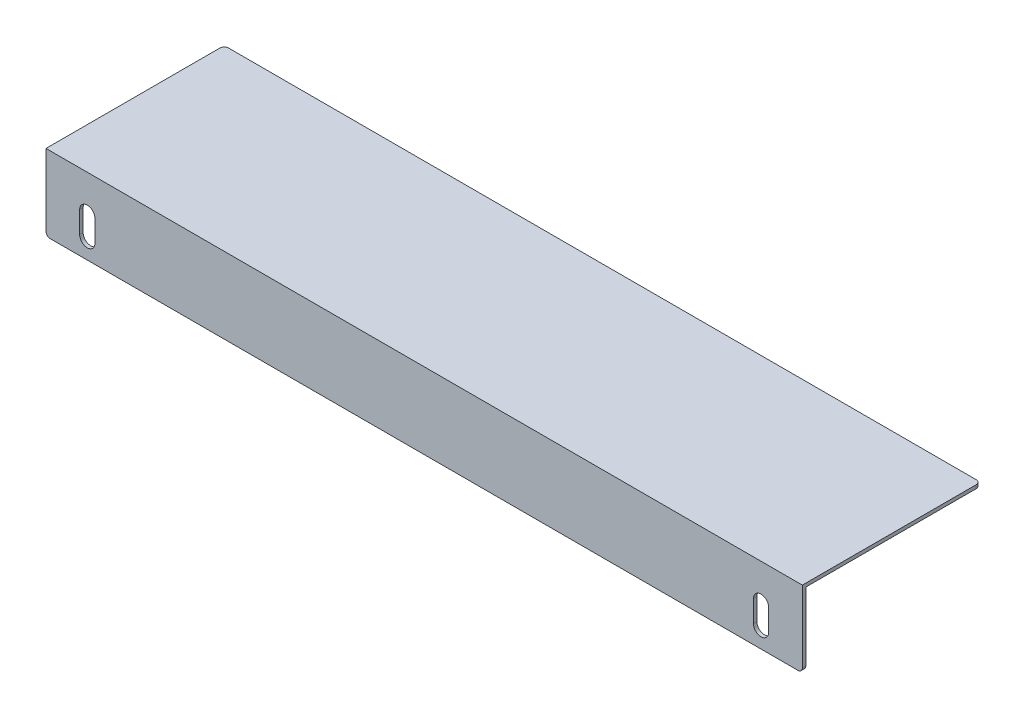
ISO-10303-21;
HEADER;
FILE_DESCRIPTION(('STEP AP214'),'2;1');
FILE_NAME('part.step','',(''),(''),'','','');
FILE_SCHEMA(('AUTOMOTIVE_DESIGN { 1 0 10303 214 1 1 1 1 }'));
ENDSEC;
DATA;
#1=APPLICATION_CONTEXT('core data for automotive mechanical design processes');
#2=APPLICATION_PROTOCOL_DEFINITION('international standard','automotive_design',2000,#1);
#3=PRODUCT_CONTEXT('',#1,'mechanical');
#4=PRODUCT('Part','Part','',(#3));
#5=PRODUCT_RELATED_PRODUCT_CATEGORY('part','',(#4));
#6=PRODUCT_DEFINITION_FORMATION('','',#4);
#7=PRODUCT_DEFINITION_CONTEXT('part definition',#1,'design');
#8=PRODUCT_DEFINITION('design','',#6,#7);
#9=PRODUCT_DEFINITION_SHAPE('','',#8);
#10=(LENGTH_UNIT() NAMED_UNIT(*) SI_UNIT(.MILLI.,.METRE.));
#11=(NAMED_UNIT(*) PLANE_ANGLE_UNIT() SI_UNIT($,.RADIAN.));
#12=(NAMED_UNIT(*) SI_UNIT($,.STERADIAN.) SOLID_ANGLE_UNIT());
#13=UNCERTAINTY_MEASURE_WITH_UNIT(LENGTH_MEASURE(1.E-05),#10,'distance_accuracy_value','');
#14=(GEOMETRIC_REPRESENTATION_CONTEXT(3) GLOBAL_UNCERTAINTY_ASSIGNED_CONTEXT((#13)) GLOBAL_UNIT_ASSIGNED_CONTEXT((#10,
#11,#12)) REPRESENTATION_CONTEXT('',''));
#15=CARTESIAN_POINT('',(0.,0.,0.));
#16=DIRECTION('',(0.,0.,1.));
#17=DIRECTION('',(1.,0.,0.));
#18=AXIS2_PLACEMENT_3D('',#15,#16,#17);
#19=CARTESIAN_POINT('',(279.,0.,0.));
#20=DIRECTION('',(0.,0.,-1.));
#21=DIRECTION('',(-1.,0.,0.));
#22=AXIS2_PLACEMENT_3D('',#19,#20,#21);
#23=PLANE('',#22);
#24=DIRECTION('',(-1.,0.,0.));
#25=VECTOR('',#24,1.);
#26=CARTESIAN_POINT('',(279.,-35.,0.));
#27=LINE('',#26,#25);
#28=CARTESIAN_POINT('',(67.,-35.,0.));
#29=VERTEX_POINT('',#28);
#30=CARTESIAN_POINT('',(-277.,-35.,0.));
#31=VERTEX_POINT('',#30);
#32=EDGE_CURVE('E41',#29,#31,#27,.T.);
#33=ORIENTED_EDGE('',*,*,#32,.F.);
#34=CARTESIAN_POINT('',(67.,-33.,0.));
#35=DIRECTION('',(0.,0.,1.));
#36=DIRECTION('',(0.,1.,0.));
#37=AXIS2_PLACEMENT_3D('',#34,#35,#36);
#38=CIRCLE('',#37,2.);
#39=CARTESIAN_POINT('',(69.,-33.,0.));
#40=VERTEX_POINT('',#39);
#41=EDGE_CURVE('E11',#29,#40,#38,.T.);
#42=ORIENTED_EDGE('',*,*,#41,.T.);
#43=DIRECTION('',(0.,1.,0.));
#44=VECTOR('',#43,1.);
#45=CARTESIAN_POINT('',(69.,-35.,0.));
#46=LINE('',#45,#44);
#47=CARTESIAN_POINT('',(69.,0.,0.));
#48=VERTEX_POINT('',#47);
#49=EDGE_CURVE('E27',#40,#48,#46,.T.);
#50=ORIENTED_EDGE('',*,*,#49,.T.);
#51=DIRECTION('',(-1.,0.,0.));
#52=VECTOR('',#51,1.);
#53=CARTESIAN_POINT('',(279.,0.,0.));
#54=LINE('',#53,#52);
#55=CARTESIAN_POINT('',(-279.,0.,0.));
#56=VERTEX_POINT('',#55);
#57=EDGE_CURVE('E261',#48,#56,#54,.T.);
#58=ORIENTED_EDGE('',*,*,#57,.T.);
#59=DIRECTION('',(0.,-1.,0.));
#60=VECTOR('',#59,1.);
#61=CARTESIAN_POINT('',(-279.,0.,0.));
#62=LINE('',#61,#60);
#63=CARTESIAN_POINT('',(-279.,-33.,0.));
#64=VERTEX_POINT('',#63);
#65=EDGE_CURVE('E267',#56,#64,#62,.T.);
#66=ORIENTED_EDGE('',*,*,#65,.T.);
#67=CARTESIAN_POINT('',(-277.,-33.,0.));
#68=DIRECTION('',(0.,0.,1.));
#69=DIRECTION('',(0.,1.,0.));
#70=AXIS2_PLACEMENT_3D('',#67,#68,#69);
#71=CIRCLE('',#70,2.);
#72=EDGE_CURVE('E216',#64,#31,#71,.T.);
#73=ORIENTED_EDGE('',*,*,#72,.T.);
#74=EDGE_LOOP('',(#33,#42,#50,#58,#66,#73));
#75=FACE_BOUND('',#74,.T.);
#76=DIRECTION('',(0.,-1.,0.));
#77=VECTOR('',#76,1.);
#78=CARTESIAN_POINT('',(-263.5,-16.6,0.));
#79=LINE('',#78,#77);
#80=CARTESIAN_POINT('',(-263.5,-16.6,0.));
#81=VERTEX_POINT('',#80);
#82=CARTESIAN_POINT('',(-263.5,-26.6,0.));
#83=VERTEX_POINT('',#82);
#84=EDGE_CURVE('E230',#81,#83,#79,.T.);
#85=ORIENTED_EDGE('',*,*,#84,.F.);
#86=CARTESIAN_POINT('',(-260.,-16.6,0.));
#87=DIRECTION('',(0.,0.,1.));
#88=DIRECTION('',(1.,0.,0.));
#89=AXIS2_PLACEMENT_3D('',#86,#87,#88);
#90=CIRCLE('',#89,3.5);
#91=CARTESIAN_POINT('',(-256.5,-16.6,0.));
#92=VERTEX_POINT('',#91);
#93=EDGE_CURVE('E274',#92,#81,#90,.T.);
#94=ORIENTED_EDGE('',*,*,#93,.F.);
#95=DIRECTION('',(0.,1.,0.));
#96=VECTOR('',#95,1.);
#97=CARTESIAN_POINT('',(-256.5,-16.6,0.));
#98=LINE('',#97,#96);
#99=CARTESIAN_POINT('',(-256.5,-26.6,0.));
#100=VERTEX_POINT('',#99);
#101=EDGE_CURVE('E203',#100,#92,#98,.T.);
#102=ORIENTED_EDGE('',*,*,#101,.F.);
#103=CARTESIAN_POINT('',(-260.,-26.6,0.));
#104=DIRECTION('',(0.,0.,1.));
#105=DIRECTION('',(1.,0.,0.));
#106=AXIS2_PLACEMENT_3D('',#103,#104,#105);
#107=CIRCLE('',#106,3.5);
#108=EDGE_CURVE('E265',#83,#100,#107,.T.);
#109=ORIENTED_EDGE('',*,*,#108,.F.);
#110=EDGE_LOOP('',(#85,#94,#102,#109));
#111=FACE_BOUND('',#110,.T.);
#112=DIRECTION('',(0.,-1.,0.));
#113=VECTOR('',#112,1.);
#114=CARTESIAN_POINT('',(46.5,-16.6,0.));
#115=LINE('',#114,#113);
#116=CARTESIAN_POINT('',(46.5,-16.6,0.));
#117=VERTEX_POINT('',#116);
#118=CARTESIAN_POINT('',(46.5,-26.6,0.));
#119=VERTEX_POINT('',#118);
#120=EDGE_CURVE('E192',#117,#119,#115,.T.);
#121=ORIENTED_EDGE('',*,*,#120,.F.);
#122=CARTESIAN_POINT('',(50.,-16.6,0.));
#123=DIRECTION('',(0.,0.,1.));
#124=DIRECTION('',(1.,0.,0.));
#125=AXIS2_PLACEMENT_3D('',#122,#123,#124);
#126=CIRCLE('',#125,3.5);
#127=CARTESIAN_POINT('',(53.5,-16.6,0.));
#128=VERTEX_POINT('',#127);
#129=EDGE_CURVE('E242',#128,#117,#126,.T.);
#130=ORIENTED_EDGE('',*,*,#129,.F.);
#131=DIRECTION('',(0.,1.,0.));
#132=VECTOR('',#131,1.);
#133=CARTESIAN_POINT('',(53.5,-16.6,0.));
#134=LINE('',#133,#132);
#135=CARTESIAN_POINT('',(53.5,-26.6,0.));
#136=VERTEX_POINT('',#135);
#137=EDGE_CURVE('E205',#136,#128,#134,.T.);
#138=ORIENTED_EDGE('',*,*,#137,.F.);
#139=CARTESIAN_POINT('',(50.,-26.6,0.));
#140=DIRECTION('',(0.,0.,1.));
#141=DIRECTION('',(1.,0.,0.));
#142=AXIS2_PLACEMENT_3D('',#139,#140,#141);
#143=CIRCLE('',#142,3.5);
#144=EDGE_CURVE('E283',#119,#136,#143,.T.);
#145=ORIENTED_EDGE('',*,*,#144,.F.);
#146=EDGE_LOOP('',(#121,#130,#138,#145));
#147=FACE_BOUND('',#146,.T.);
#148=ADVANCED_FACE('F16',(#75,#111,#147),#23,.F.);
#149=CARTESIAN_POINT('',(279.,-35.,-1.6));
#150=DIRECTION('',(0.,-1.,0.));
#151=DIRECTION('',(0.,0.,-1.));
#152=AXIS2_PLACEMENT_3D('',#149,#150,#151);
#153=PLANE('',#152);
#154=DIRECTION('',(-1.,0.,0.));
#155=VECTOR('',#154,1.);
#156=CARTESIAN_POINT('',(279.,-35.,-1.6));
#157=LINE('',#156,#155);
#158=CARTESIAN_POINT('',(67.,-35.,-1.6));
#159=VERTEX_POINT('',#158);
#160=CARTESIAN_POINT('',(-277.,-35.,-1.6));
#161=VERTEX_POINT('',#160);
#162=EDGE_CURVE('E186',#159,#161,#157,.T.);
#163=ORIENTED_EDGE('',*,*,#162,.F.);
#164=DIRECTION('',(0.,0.,1.));
#165=VECTOR('',#164,1.);
#166=CARTESIAN_POINT('',(67.,-35.,0.));
#167=LINE('',#166,#165);
#168=EDGE_CURVE('E183',#159,#29,#167,.T.);
#169=ORIENTED_EDGE('',*,*,#168,.T.);
#170=ORIENTED_EDGE('',*,*,#32,.T.);
#171=DIRECTION('',(0.,0.,-1.));
#172=VECTOR('',#171,1.);
#173=CARTESIAN_POINT('',(-277.,-35.,-1.6));
#174=LINE('',#173,#172);
#175=EDGE_CURVE('E185',#31,#161,#174,.T.);
#176=ORIENTED_EDGE('',*,*,#175,.T.);
#177=EDGE_LOOP('',(#163,#169,#170,#176));
#178=FACE_BOUND('',#177,.T.);
#179=ADVANCED_FACE('F441',(#178),#153,.T.);
#180=CARTESIAN_POINT('',(279.,0.,-1.6));
#181=DIRECTION('',(0.,0.,-1.));
#182=DIRECTION('',(-1.,0.,0.));
#183=AXIS2_PLACEMENT_3D('',#180,#181,#182);
#184=PLANE('',#183);
#185=DIRECTION('',(0.,1.,0.));
#186=VECTOR('',#185,1.);
#187=CARTESIAN_POINT('',(69.,0.,-1.6));
#188=LINE('',#187,#186);
#189=CARTESIAN_POINT('',(69.,-33.,-1.6));
#190=VERTEX_POINT('',#189);
#191=CARTESIAN_POINT('',(69.,-1.6,-1.6));
#192=VERTEX_POINT('',#191);
#193=EDGE_CURVE('E162',#190,#192,#188,.T.);
#194=ORIENTED_EDGE('',*,*,#193,.F.);
#195=CARTESIAN_POINT('',(67.,-33.,-1.6));
#196=DIRECTION('',(0.,0.,-1.));
#197=DIRECTION('',(0.,1.,0.));
#198=AXIS2_PLACEMENT_3D('',#195,#196,#197);
#199=CIRCLE('',#198,2.);
#200=EDGE_CURVE('E166',#190,#159,#199,.T.);
#201=ORIENTED_EDGE('',*,*,#200,.T.);
#202=ORIENTED_EDGE('',*,*,#162,.T.);
#203=CARTESIAN_POINT('',(-277.,-33.,-1.6));
#204=DIRECTION('',(0.,0.,-1.));
#205=DIRECTION('',(0.,1.,0.));
#206=AXIS2_PLACEMENT_3D('',#203,#204,#205);
#207=CIRCLE('',#206,2.);
#208=CARTESIAN_POINT('',(-279.,-33.,-1.6));
#209=VERTEX_POINT('',#208);
#210=EDGE_CURVE('E213',#161,#209,#207,.T.);
#211=ORIENTED_EDGE('',*,*,#210,.T.);
#212=DIRECTION('',(0.,-1.,0.));
#213=VECTOR('',#212,1.);
#214=CARTESIAN_POINT('',(-279.,0.,-1.6));
#215=LINE('',#214,#213);
#216=CARTESIAN_POINT('',(-279.,-1.6,-1.6));
#217=VERTEX_POINT('',#216);
#218=EDGE_CURVE('E241',#217,#209,#215,.T.);
#219=ORIENTED_EDGE('',*,*,#218,.F.);
#220=DIRECTION('',(-1.,0.,0.));
#221=VECTOR('',#220,1.);
#222=CARTESIAN_POINT('',(279.,-1.6,-1.6));
#223=LINE('',#222,#221);
#224=EDGE_CURVE('E169',#192,#217,#223,.T.);
#225=ORIENTED_EDGE('',*,*,#224,.F.);
#226=EDGE_LOOP('',(#194,#201,#202,#211,#219,#225));
#227=FACE_BOUND('',#226,.T.);
#228=CARTESIAN_POINT('',(-260.,-16.6,-1.6));
#229=DIRECTION('',(0.,0.,-1.));
#230=DIRECTION('',(0.,1.,0.));
#231=AXIS2_PLACEMENT_3D('',#228,#229,#230);
#232=CIRCLE('',#231,3.5);
#233=CARTESIAN_POINT('',(-263.5,-16.6,-1.6));
#234=VERTEX_POINT('',#233);
#235=CARTESIAN_POINT('',(-256.5,-16.6,-1.6));
#236=VERTEX_POINT('',#235);
#237=EDGE_CURVE('E329',#234,#236,#232,.T.);
#238=ORIENTED_EDGE('',*,*,#237,.F.);
#239=DIRECTION('',(0.,1.,0.));
#240=VECTOR('',#239,1.);
#241=CARTESIAN_POINT('',(-263.5,0.,-1.6));
#242=LINE('',#241,#240);
#243=CARTESIAN_POINT('',(-263.5,-26.6,-1.6));
#244=VERTEX_POINT('',#243);
#245=EDGE_CURVE('E262',#244,#234,#242,.T.);
#246=ORIENTED_EDGE('',*,*,#245,.F.);
#247=CARTESIAN_POINT('',(-260.,-26.6,-1.6));
#248=DIRECTION('',(0.,0.,-1.));
#249=DIRECTION('',(0.,1.,0.));
#250=AXIS2_PLACEMENT_3D('',#247,#248,#249);
#251=CIRCLE('',#250,3.5);
#252=CARTESIAN_POINT('',(-256.5,-26.6,-1.6));
#253=VERTEX_POINT('',#252);
#254=EDGE_CURVE('E319',#253,#244,#251,.T.);
#255=ORIENTED_EDGE('',*,*,#254,.F.);
#256=DIRECTION('',(0.,-1.,0.));
#257=VECTOR('',#256,1.);
#258=CARTESIAN_POINT('',(-256.5,0.,-1.6));
#259=LINE('',#258,#257);
#260=EDGE_CURVE('E271',#236,#253,#259,.T.);
#261=ORIENTED_EDGE('',*,*,#260,.F.);
#262=EDGE_LOOP('',(#238,#246,#255,#261));
#263=FACE_BOUND('',#262,.T.);
#264=CARTESIAN_POINT('',(50.,-16.6,-1.6));
#265=DIRECTION('',(0.,0.,-1.));
#266=DIRECTION('',(0.,1.,0.));
#267=AXIS2_PLACEMENT_3D('',#264,#265,#266);
#268=CIRCLE('',#267,3.5);
#269=CARTESIAN_POINT('',(46.5,-16.6,-1.6));
#270=VERTEX_POINT('',#269);
#271=CARTESIAN_POINT('',(53.5,-16.6,-1.6));
#272=VERTEX_POINT('',#271);
#273=EDGE_CURVE('E226',#270,#272,#268,.T.);
#274=ORIENTED_EDGE('',*,*,#273,.F.);
#275=DIRECTION('',(0.,1.,0.));
#276=VECTOR('',#275,1.);
#277=CARTESIAN_POINT('',(46.5,-1.0648955028471E-13,-1.6));
#278=LINE('',#277,#276);
#279=CARTESIAN_POINT('',(46.5,-26.6,-1.6));
#280=VERTEX_POINT('',#279);
#281=EDGE_CURVE('E235',#280,#270,#278,.T.);
#282=ORIENTED_EDGE('',*,*,#281,.F.);
#283=CARTESIAN_POINT('',(50.,-26.6,-1.6));
#284=DIRECTION('',(0.,0.,-1.));
#285=DIRECTION('',(0.,1.,0.));
#286=AXIS2_PLACEMENT_3D('',#283,#284,#285);
#287=CIRCLE('',#286,3.5);
#288=CARTESIAN_POINT('',(53.5,-26.6,-1.6));
#289=VERTEX_POINT('',#288);
#290=EDGE_CURVE('E208',#289,#280,#287,.T.);
#291=ORIENTED_EDGE('',*,*,#290,.F.);
#292=DIRECTION('',(0.,-1.,0.));
#293=VECTOR('',#292,1.);
#294=CARTESIAN_POINT('',(53.5,0.,-1.6));
#295=LINE('',#294,#293);
#296=EDGE_CURVE('E246',#272,#289,#295,.T.);
#297=ORIENTED_EDGE('',*,*,#296,.F.);
#298=EDGE_LOOP('',(#274,#282,#291,#297));
#299=FACE_BOUND('',#298,.T.);
#300=ADVANCED_FACE('F164',(#227,#263,#299),#184,.T.);
#301=CARTESIAN_POINT('',(279.,-1.6,-82.));
#302=DIRECTION('',(0.,-1.,0.));
#303=DIRECTION('',(-1.,0.,0.));
#304=AXIS2_PLACEMENT_3D('',#301,#302,#303);
#305=PLANE('',#304);
#306=DIRECTION('',(-1.,0.,0.));
#307=VECTOR('',#306,1.);
#308=CARTESIAN_POINT('',(279.,-1.6,-82.));
#309=LINE('',#308,#307);
#310=CARTESIAN_POINT('',(67.,-1.6,-82.));
#311=VERTEX_POINT('',#310);
#312=CARTESIAN_POINT('',(-277.,-1.6,-82.));
#313=VERTEX_POINT('',#312);
#314=EDGE_CURVE('E217',#311,#313,#309,.T.);
#315=ORIENTED_EDGE('',*,*,#314,.F.);
#316=CARTESIAN_POINT('',(67.,-1.6,-80.));
#317=DIRECTION('',(0.,-1.,0.));
#318=DIRECTION('',(0.,0.,-1.));
#319=AXIS2_PLACEMENT_3D('',#316,#317,#318);
#320=CIRCLE('',#319,2.);
#321=CARTESIAN_POINT('',(69.,-1.6,-80.));
#322=VERTEX_POINT('',#321);
#323=EDGE_CURVE('E209',#311,#322,#320,.T.);
#324=ORIENTED_EDGE('',*,*,#323,.T.);
#325=DIRECTION('',(0.,0.,-1.));
#326=VECTOR('',#325,1.);
#327=CARTESIAN_POINT('',(69.,-1.6,-82.));
#328=LINE('',#327,#326);
#329=EDGE_CURVE('E176',#192,#322,#328,.T.);
#330=ORIENTED_EDGE('',*,*,#329,.F.);
#331=ORIENTED_EDGE('',*,*,#224,.T.);
#332=DIRECTION('',(0.,0.,1.));
#333=VECTOR('',#332,1.);
#334=CARTESIAN_POINT('',(-279.,-1.6,-82.));
#335=LINE('',#334,#333);
#336=CARTESIAN_POINT('',(-279.,-1.6,-80.));
#337=VERTEX_POINT('',#336);
#338=EDGE_CURVE('E282',#337,#217,#335,.T.);
#339=ORIENTED_EDGE('',*,*,#338,.F.);
#340=CARTESIAN_POINT('',(-277.,-1.6,-80.));
#341=DIRECTION('',(0.,-1.,0.));
#342=DIRECTION('',(0.,0.,-1.));
#343=AXIS2_PLACEMENT_3D('',#340,#341,#342);
#344=CIRCLE('',#343,2.);
#345=EDGE_CURVE('E225',#337,#313,#344,.T.);
#346=ORIENTED_EDGE('',*,*,#345,.T.);
#347=EDGE_LOOP('',(#315,#324,#330,#331,#339,#346));
#348=FACE_BOUND('',#347,.T.);
#349=ADVANCED_FACE('F426',(#348),#305,.T.);
#350=CARTESIAN_POINT('',(279.,0.,-82.));
#351=DIRECTION('',(0.,0.,-1.));
#352=DIRECTION('',(0.,-1.,0.));
#353=AXIS2_PLACEMENT_3D('',#350,#351,#352);
#354=PLANE('',#353);
#355=DIRECTION('',(-1.,0.,0.));
#356=VECTOR('',#355,1.);
#357=CARTESIAN_POINT('',(279.,0.,-82.));
#358=LINE('',#357,#356);
#359=CARTESIAN_POINT('',(67.,0.,-82.));
#360=VERTEX_POINT('',#359);
#361=CARTESIAN_POINT('',(-277.,0.,-82.));
#362=VERTEX_POINT('',#361);
#363=EDGE_CURVE('E294',#360,#362,#358,.T.);
#364=ORIENTED_EDGE('',*,*,#363,.F.);
#365=DIRECTION('',(0.,-1.,0.));
#366=VECTOR('',#365,1.);
#367=CARTESIAN_POINT('',(67.,-1.6,-82.));
#368=LINE('',#367,#366);
#369=EDGE_CURVE('E220',#360,#311,#368,.T.);
#370=ORIENTED_EDGE('',*,*,#369,.T.);
#371=ORIENTED_EDGE('',*,*,#314,.T.);
#372=DIRECTION('',(0.,1.,0.));
#373=VECTOR('',#372,1.);
#374=CARTESIAN_POINT('',(-277.,0.,-82.));
#375=LINE('',#374,#373);
#376=EDGE_CURVE('E221',#313,#362,#375,.T.);
#377=ORIENTED_EDGE('',*,*,#376,.T.);
#378=EDGE_LOOP('',(#364,#370,#371,#377));
#379=FACE_BOUND('',#378,.T.);
#380=ADVANCED_FACE('F427',(#379),#354,.T.);
#381=CARTESIAN_POINT('',(279.,0.,-82.));
#382=DIRECTION('',(0.,-1.,0.));
#383=DIRECTION('',(-1.,0.,0.));
#384=AXIS2_PLACEMENT_3D('',#381,#382,#383);
#385=PLANE('',#384);
#386=DIRECTION('',(0.,0.,1.));
#387=VECTOR('',#386,1.);
#388=CARTESIAN_POINT('',(69.,0.,-82.));
#389=LINE('',#388,#387);
#390=CARTESIAN_POINT('',(69.,0.,-80.));
#391=VERTEX_POINT('',#390);
#392=EDGE_CURVE('E313',#391,#48,#389,.T.);
#393=ORIENTED_EDGE('',*,*,#392,.F.);
#394=CARTESIAN_POINT('',(67.,0.,-80.));
#395=DIRECTION('',(0.,1.,0.));
#396=DIRECTION('',(0.,0.,-1.));
#397=AXIS2_PLACEMENT_3D('',#394,#395,#396);
#398=CIRCLE('',#397,2.);
#399=EDGE_CURVE('E20',#391,#360,#398,.T.);
#400=ORIENTED_EDGE('',*,*,#399,.T.);
#401=ORIENTED_EDGE('',*,*,#363,.T.);
#402=CARTESIAN_POINT('',(-277.,0.,-80.));
#403=DIRECTION('',(0.,1.,0.));
#404=DIRECTION('',(0.,0.,-1.));
#405=AXIS2_PLACEMENT_3D('',#402,#403,#404);
#406=CIRCLE('',#405,2.);
#407=CARTESIAN_POINT('',(-279.,0.,-80.));
#408=VERTEX_POINT('',#407);
#409=EDGE_CURVE('E240',#362,#408,#406,.T.);
#410=ORIENTED_EDGE('',*,*,#409,.T.);
#411=DIRECTION('',(0.,0.,1.));
#412=VECTOR('',#411,1.);
#413=CARTESIAN_POINT('',(-279.,0.,-82.));
#414=LINE('',#413,#412);
#415=EDGE_CURVE('E236',#408,#56,#414,.T.);
#416=ORIENTED_EDGE('',*,*,#415,.T.);
#417=ORIENTED_EDGE('',*,*,#57,.F.);
#418=EDGE_LOOP('',(#393,#400,#401,#410,#416,#417));
#419=FACE_BOUND('',#418,.T.);
#420=ADVANCED_FACE('F344',(#419),#385,.F.);
#421=CARTESIAN_POINT('',(-279.,0.,0.));
#422=DIRECTION('',(-1.,0.,0.));
#423=DIRECTION('',(0.,0.,1.));
#424=AXIS2_PLACEMENT_3D('',#421,#422,#423);
#425=PLANE('',#424);
#426=ORIENTED_EDGE('',*,*,#218,.T.);
#427=DIRECTION('',(0.,0.,1.));
#428=VECTOR('',#427,1.);
#429=CARTESIAN_POINT('',(-279.,-33.,0.));
#430=LINE('',#429,#428);
#431=EDGE_CURVE('E281',#209,#64,#430,.T.);
#432=ORIENTED_EDGE('',*,*,#431,.T.);
#433=ORIENTED_EDGE('',*,*,#65,.F.);
#434=ORIENTED_EDGE('',*,*,#415,.F.);
#435=DIRECTION('',(0.,-1.,0.));
#436=VECTOR('',#435,1.);
#437=CARTESIAN_POINT('',(-279.,0.,-80.));
#438=LINE('',#437,#436);
#439=EDGE_CURVE('E277',#408,#337,#438,.T.);
#440=ORIENTED_EDGE('',*,*,#439,.T.);
#441=ORIENTED_EDGE('',*,*,#338,.T.);
#442=EDGE_LOOP('',(#426,#432,#433,#434,#440,#441));
#443=FACE_BOUND('',#442,.T.);
#444=ADVANCED_FACE('F18',(#443),#425,.T.);
#445=CARTESIAN_POINT('',(-260.,-16.6,-10.));
#446=DIRECTION('',(0.,0.,1.));
#447=DIRECTION('',(1.,0.,0.));
#448=AXIS2_PLACEMENT_3D('',#445,#446,#447);
#449=CYLINDRICAL_SURFACE('',#448,3.5);
#450=ORIENTED_EDGE('',*,*,#237,.T.);
#451=DIRECTION('',(0.,0.,1.));
#452=VECTOR('',#451,1.);
#453=CARTESIAN_POINT('',(-256.5,-16.6,-10.));
#454=LINE('',#453,#452);
#455=EDGE_CURVE('E298',#236,#92,#454,.T.);
#456=ORIENTED_EDGE('',*,*,#455,.T.);
#457=ORIENTED_EDGE('',*,*,#93,.T.);
#458=DIRECTION('',(0.,0.,1.));
#459=VECTOR('',#458,1.);
#460=CARTESIAN_POINT('',(-263.5,-16.6,-10.));
#461=LINE('',#460,#459);
#462=EDGE_CURVE('E266',#234,#81,#461,.T.);
#463=ORIENTED_EDGE('',*,*,#462,.F.);
#464=EDGE_LOOP('',(#450,#456,#457,#463));
#465=FACE_BOUND('',#464,.T.);
#466=ADVANCED_FACE('F463',(#465),#449,.F.);
#467=CARTESIAN_POINT('',(-256.5,-16.6,-10.));
#468=DIRECTION('',(1.,0.,0.));
#469=DIRECTION('',(0.,1.,0.));
#470=AXIS2_PLACEMENT_3D('',#467,#468,#469);
#471=PLANE('',#470);
#472=ORIENTED_EDGE('',*,*,#260,.T.);
#473=DIRECTION('',(0.,0.,1.));
#474=VECTOR('',#473,1.);
#475=CARTESIAN_POINT('',(-256.5,-26.6,-10.));
#476=LINE('',#475,#474);
#477=EDGE_CURVE('E275',#253,#100,#476,.T.);
#478=ORIENTED_EDGE('',*,*,#477,.T.);
#479=ORIENTED_EDGE('',*,*,#101,.T.);
#480=ORIENTED_EDGE('',*,*,#455,.F.);
#481=EDGE_LOOP('',(#472,#478,#479,#480));
#482=FACE_BOUND('',#481,.T.);
#483=ADVANCED_FACE('F461',(#482),#471,.F.);
#484=CARTESIAN_POINT('',(-260.,-26.6,-10.));
#485=DIRECTION('',(0.,0.,1.));
#486=DIRECTION('',(1.,0.,0.));
#487=AXIS2_PLACEMENT_3D('',#484,#485,#486);
#488=CYLINDRICAL_SURFACE('',#487,3.5);
#489=ORIENTED_EDGE('',*,*,#254,.T.);
#490=DIRECTION('',(0.,0.,1.));
#491=VECTOR('',#490,1.);
#492=CARTESIAN_POINT('',(-263.5,-26.6,-10.));
#493=LINE('',#492,#491);
#494=EDGE_CURVE('E309',#244,#83,#493,.T.);
#495=ORIENTED_EDGE('',*,*,#494,.T.);
#496=ORIENTED_EDGE('',*,*,#108,.T.);
#497=ORIENTED_EDGE('',*,*,#477,.F.);
#498=EDGE_LOOP('',(#489,#495,#496,#497));
#499=FACE_BOUND('',#498,.T.);
#500=ADVANCED_FACE('F459',(#499),#488,.F.);
#501=CARTESIAN_POINT('',(-263.5,-16.6,-10.));
#502=DIRECTION('',(-1.,0.,0.));
#503=DIRECTION('',(0.,0.,1.));
#504=AXIS2_PLACEMENT_3D('',#501,#502,#503);
#505=PLANE('',#504);
#506=ORIENTED_EDGE('',*,*,#245,.T.);
#507=ORIENTED_EDGE('',*,*,#462,.T.);
#508=ORIENTED_EDGE('',*,*,#84,.T.);
#509=ORIENTED_EDGE('',*,*,#494,.F.);
#510=EDGE_LOOP('',(#506,#507,#508,#509));
#511=FACE_BOUND('',#510,.T.);
#512=ADVANCED_FACE('F456',(#511),#505,.F.);
#513=CARTESIAN_POINT('',(50.,-16.6,-10.));
#514=DIRECTION('',(0.,0.,1.));
#515=DIRECTION('',(1.,0.,0.));
#516=AXIS2_PLACEMENT_3D('',#513,#514,#515);
#517=CYLINDRICAL_SURFACE('',#516,3.5);
#518=ORIENTED_EDGE('',*,*,#273,.T.);
#519=DIRECTION('',(0.,0.,1.));
#520=VECTOR('',#519,1.);
#521=CARTESIAN_POINT('',(53.5,-16.6,-10.));
#522=LINE('',#521,#520);
#523=EDGE_CURVE('E231',#272,#128,#522,.T.);
#524=ORIENTED_EDGE('',*,*,#523,.T.);
#525=ORIENTED_EDGE('',*,*,#129,.T.);
#526=DIRECTION('',(0.,0.,1.));
#527=VECTOR('',#526,1.);
#528=CARTESIAN_POINT('',(46.5,-16.6,-10.));
#529=LINE('',#528,#527);
#530=EDGE_CURVE('E199',#270,#117,#529,.T.);
#531=ORIENTED_EDGE('',*,*,#530,.F.);
#532=EDGE_LOOP('',(#518,#524,#525,#531));
#533=FACE_BOUND('',#532,.T.);
#534=ADVANCED_FACE('F373',(#533),#517,.F.);
#535=CARTESIAN_POINT('',(53.5,-16.6,-10.));
#536=DIRECTION('',(1.,0.,0.));
#537=DIRECTION('',(0.,1.,0.));
#538=AXIS2_PLACEMENT_3D('',#535,#536,#537);
#539=PLANE('',#538);
#540=ORIENTED_EDGE('',*,*,#296,.T.);
#541=DIRECTION('',(0.,0.,1.));
#542=VECTOR('',#541,1.);
#543=CARTESIAN_POINT('',(53.5,-26.6,-10.));
#544=LINE('',#543,#542);
#545=EDGE_CURVE('E207',#289,#136,#544,.T.);
#546=ORIENTED_EDGE('',*,*,#545,.T.);
#547=ORIENTED_EDGE('',*,*,#137,.T.);
#548=ORIENTED_EDGE('',*,*,#523,.F.);
#549=EDGE_LOOP('',(#540,#546,#547,#548));
#550=FACE_BOUND('',#549,.T.);
#551=ADVANCED_FACE('F378',(#550),#539,.F.);
#552=CARTESIAN_POINT('',(50.,-26.6,-10.));
#553=DIRECTION('',(0.,0.,1.));
#554=DIRECTION('',(1.,0.,0.));
#555=AXIS2_PLACEMENT_3D('',#552,#553,#554);
#556=CYLINDRICAL_SURFACE('',#555,3.5);
#557=ORIENTED_EDGE('',*,*,#290,.T.);
#558=DIRECTION('',(0.,0.,1.));
#559=VECTOR('',#558,1.);
#560=CARTESIAN_POINT('',(46.5,-26.6,-10.));
#561=LINE('',#560,#559);
#562=EDGE_CURVE('E253',#280,#119,#561,.T.);
#563=ORIENTED_EDGE('',*,*,#562,.T.);
#564=ORIENTED_EDGE('',*,*,#144,.T.);
#565=ORIENTED_EDGE('',*,*,#545,.F.);
#566=EDGE_LOOP('',(#557,#563,#564,#565));
#567=FACE_BOUND('',#566,.T.);
#568=ADVANCED_FACE('F392',(#567),#556,.F.);
#569=CARTESIAN_POINT('',(46.5,-16.6,-10.));
#570=DIRECTION('',(-1.,0.,0.));
#571=DIRECTION('',(0.,1.,0.));
#572=AXIS2_PLACEMENT_3D('',#569,#570,#571);
#573=PLANE('',#572);
#574=ORIENTED_EDGE('',*,*,#281,.T.);
#575=ORIENTED_EDGE('',*,*,#530,.T.);
#576=ORIENTED_EDGE('',*,*,#120,.T.);
#577=ORIENTED_EDGE('',*,*,#562,.F.);
#578=EDGE_LOOP('',(#574,#575,#576,#577));
#579=FACE_BOUND('',#578,.T.);
#580=ADVANCED_FACE('F389',(#579),#573,.F.);
#581=CARTESIAN_POINT('',(-277.,-33.,0.));
#582=DIRECTION('',(0.,0.,1.));
#583=DIRECTION('',(1.,0.,0.));
#584=AXIS2_PLACEMENT_3D('',#581,#582,#583);
#585=CYLINDRICAL_SURFACE('',#584,2.);
#586=ORIENTED_EDGE('',*,*,#210,.F.);
#587=ORIENTED_EDGE('',*,*,#175,.F.);
#588=ORIENTED_EDGE('',*,*,#72,.F.);
#589=ORIENTED_EDGE('',*,*,#431,.F.);
#590=EDGE_LOOP('',(#586,#587,#588,#589));
#591=FACE_BOUND('',#590,.T.);
#592=ADVANCED_FACE('F356',(#591),#585,.T.);
#593=CARTESIAN_POINT('',(-277.,0.,-80.));
#594=DIRECTION('',(0.,-1.,0.));
#595=DIRECTION('',(0.,0.,-1.));
#596=AXIS2_PLACEMENT_3D('',#593,#594,#595);
#597=CYLINDRICAL_SURFACE('',#596,2.);
#598=ORIENTED_EDGE('',*,*,#409,.F.);
#599=ORIENTED_EDGE('',*,*,#376,.F.);
#600=ORIENTED_EDGE('',*,*,#345,.F.);
#601=ORIENTED_EDGE('',*,*,#439,.F.);
#602=EDGE_LOOP('',(#598,#599,#600,#601));
#603=FACE_BOUND('',#602,.T.);
#604=ADVANCED_FACE('F430',(#603),#597,.T.);
#605=CARTESIAN_POINT('',(69.,-35.,-82.));
#606=DIRECTION('',(-1.,0.,0.));
#607=DIRECTION('',(0.,1.,0.));
#608=AXIS2_PLACEMENT_3D('',#605,#606,#607);
#609=PLANE('',#608);
#610=ORIENTED_EDGE('',*,*,#49,.F.);
#611=DIRECTION('',(0.,0.,-1.));
#612=VECTOR('',#611,1.);
#613=CARTESIAN_POINT('',(69.,-33.,-1.6));
#614=LINE('',#613,#612);
#615=EDGE_CURVE('E175',#40,#190,#614,.T.);
#616=ORIENTED_EDGE('',*,*,#615,.T.);
#617=ORIENTED_EDGE('',*,*,#193,.T.);
#618=ORIENTED_EDGE('',*,*,#329,.T.);
#619=DIRECTION('',(0.,1.,0.));
#620=VECTOR('',#619,1.);
#621=CARTESIAN_POINT('',(69.,0.,-80.));
#622=LINE('',#621,#620);
#623=EDGE_CURVE('E249',#322,#391,#622,.T.);
#624=ORIENTED_EDGE('',*,*,#623,.T.);
#625=ORIENTED_EDGE('',*,*,#392,.T.);
#626=EDGE_LOOP('',(#610,#616,#617,#618,#624,#625));
#627=FACE_BOUND('',#626,.T.);
#628=ADVANCED_FACE('F188',(#627),#609,.F.);
#629=CARTESIAN_POINT('',(67.,-33.,-1.59999999999986));
#630=DIRECTION('',(0.,0.,-1.));
#631=DIRECTION('',(-1.,0.,0.));
#632=AXIS2_PLACEMENT_3D('',#629,#630,#631);
#633=CYLINDRICAL_SURFACE('',#632,2.);
#634=ORIENTED_EDGE('',*,*,#200,.F.);
#635=ORIENTED_EDGE('',*,*,#615,.F.);
#636=ORIENTED_EDGE('',*,*,#41,.F.);
#637=ORIENTED_EDGE('',*,*,#168,.F.);
#638=EDGE_LOOP('',(#634,#635,#636,#637));
#639=FACE_BOUND('',#638,.T.);
#640=ADVANCED_FACE('F181',(#639),#633,.T.);
#641=CARTESIAN_POINT('',(67.,-35.,-80.));
#642=DIRECTION('',(0.,-1.,0.));
#643=DIRECTION('',(1.,0.,0.));
#644=AXIS2_PLACEMENT_3D('',#641,#642,#643);
#645=CYLINDRICAL_SURFACE('',#644,2.);
#646=ORIENTED_EDGE('',*,*,#323,.F.);
#647=ORIENTED_EDGE('',*,*,#369,.F.);
#648=ORIENTED_EDGE('',*,*,#399,.F.);
#649=ORIENTED_EDGE('',*,*,#623,.F.);
#650=EDGE_LOOP('',(#646,#647,#648,#649));
#651=FACE_BOUND('',#650,.T.);
#652=ADVANCED_FACE('F422',(#651),#645,.T.);
#653=CLOSED_SHELL('',(#148,#179,#300,#349,#380,#420,#444,#466,#483,#500,#512,#534,#551,#568,
#580,#592,#604,#628,#640,#652));
#654=MANIFOLD_SOLID_BREP('B1',#653);
#655=ADVANCED_BREP_SHAPE_REPRESENTATION('',(#18,#654),#14);
#656=SHAPE_DEFINITION_REPRESENTATION(#9,#655);
ENDSEC;
END-ISO-10303-21;
